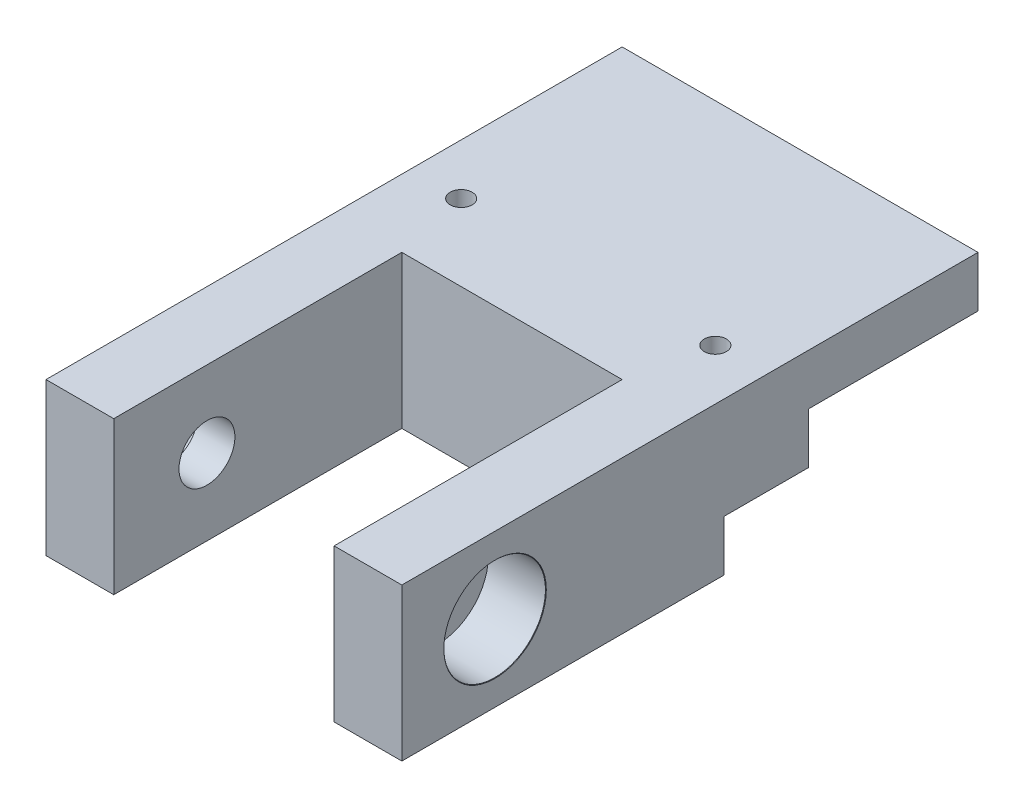
ISO-10303-21;
HEADER;
FILE_DESCRIPTION(('STEP AP214'),'2;1');
FILE_NAME('part.step','',(''),(''),'','','');
FILE_SCHEMA(('AUTOMOTIVE_DESIGN { 1 0 10303 214 1 1 1 1 }'));
ENDSEC;
DATA;
#1=APPLICATION_CONTEXT('core data for automotive mechanical design processes');
#2=APPLICATION_PROTOCOL_DEFINITION('international standard','automotive_design',2000,#1);
#3=PRODUCT_CONTEXT('',#1,'mechanical');
#4=PRODUCT('Part','Part','',(#3));
#5=PRODUCT_RELATED_PRODUCT_CATEGORY('part','',(#4));
#6=PRODUCT_DEFINITION_FORMATION('','',#4);
#7=PRODUCT_DEFINITION_CONTEXT('part definition',#1,'design');
#8=PRODUCT_DEFINITION('design','',#6,#7);
#9=PRODUCT_DEFINITION_SHAPE('','',#8);
#10=(LENGTH_UNIT() NAMED_UNIT(*) SI_UNIT(.MILLI.,.METRE.));
#11=(NAMED_UNIT(*) PLANE_ANGLE_UNIT() SI_UNIT($,.RADIAN.));
#12=(NAMED_UNIT(*) SI_UNIT($,.STERADIAN.) SOLID_ANGLE_UNIT());
#13=UNCERTAINTY_MEASURE_WITH_UNIT(LENGTH_MEASURE(1.E-05),#10,'distance_accuracy_value','');
#14=(GEOMETRIC_REPRESENTATION_CONTEXT(3) GLOBAL_UNCERTAINTY_ASSIGNED_CONTEXT((#13)) GLOBAL_UNIT_ASSIGNED_CONTEXT((#10,
#11,#12)) REPRESENTATION_CONTEXT('',''));
#15=CARTESIAN_POINT('',(0.,0.,0.));
#16=DIRECTION('',(0.,0.,1.));
#17=DIRECTION('',(1.,0.,0.));
#18=AXIS2_PLACEMENT_3D('',#15,#16,#17);
#19=CARTESIAN_POINT('',(10.5,9.,-17.));
#20=DIRECTION('',(-1.,0.,0.));
#21=DIRECTION('',(0.,0.,1.));
#22=AXIS2_PLACEMENT_3D('',#19,#20,#21);
#23=PLANE('',#22);
#24=DIRECTION('',(0.,0.,-1.));
#25=VECTOR('',#24,1.);
#26=CARTESIAN_POINT('',(10.5,0.,-17.));
#27=LINE('',#26,#25);
#28=CARTESIAN_POINT('',(10.5,0.,17.));
#29=VERTEX_POINT('',#28);
#30=CARTESIAN_POINT('',(10.5,0.,-2.00000000000001));
#31=VERTEX_POINT('',#30);
#32=EDGE_CURVE('E286',#29,#31,#27,.T.);
#33=ORIENTED_EDGE('',*,*,#32,.T.);
#34=DIRECTION('',(0.,-1.,0.));
#35=VECTOR('',#34,1.);
#36=CARTESIAN_POINT('',(10.5,3.,-2.00000000000001));
#37=LINE('',#36,#35);
#38=CARTESIAN_POINT('',(10.5,3.,-2.00000000000001));
#39=VERTEX_POINT('',#38);
#40=EDGE_CURVE('E267',#39,#31,#37,.T.);
#41=ORIENTED_EDGE('',*,*,#40,.F.);
#42=DIRECTION('',(0.,0.,1.));
#43=VECTOR('',#42,1.);
#44=CARTESIAN_POINT('',(10.5,3.,-17.));
#45=LINE('',#44,#43);
#46=CARTESIAN_POINT('',(10.5,3.,-7.));
#47=VERTEX_POINT('',#46);
#48=EDGE_CURVE('E262',#47,#39,#45,.T.);
#49=ORIENTED_EDGE('',*,*,#48,.F.);
#50=DIRECTION('',(0.,-1.,0.));
#51=VECTOR('',#50,1.);
#52=CARTESIAN_POINT('',(10.5,6.,-7.));
#53=LINE('',#52,#51);
#54=CARTESIAN_POINT('',(10.5,6.,-7.));
#55=VERTEX_POINT('',#54);
#56=EDGE_CURVE('E282',#55,#47,#53,.T.);
#57=ORIENTED_EDGE('',*,*,#56,.F.);
#58=DIRECTION('',(0.,0.,1.));
#59=VECTOR('',#58,1.);
#60=CARTESIAN_POINT('',(10.5,6.,-7.));
#61=LINE('',#60,#59);
#62=CARTESIAN_POINT('',(10.5,6.,-17.));
#63=VERTEX_POINT('',#62);
#64=EDGE_CURVE('E277',#63,#55,#61,.T.);
#65=ORIENTED_EDGE('',*,*,#64,.F.);
#66=DIRECTION('',(0.,-1.,0.));
#67=VECTOR('',#66,1.);
#68=CARTESIAN_POINT('',(10.5,9.,-17.));
#69=LINE('',#68,#67);
#70=CARTESIAN_POINT('',(10.5,9.,-17.));
#71=VERTEX_POINT('',#70);
#72=EDGE_CURVE('E46',#71,#63,#69,.T.);
#73=ORIENTED_EDGE('',*,*,#72,.F.);
#74=DIRECTION('',(0.,0.,-1.));
#75=VECTOR('',#74,1.);
#76=CARTESIAN_POINT('',(10.5,9.,-17.));
#77=LINE('',#76,#75);
#78=CARTESIAN_POINT('',(10.5,9.,17.));
#79=VERTEX_POINT('',#78);
#80=EDGE_CURVE('E289',#79,#71,#77,.T.);
#81=ORIENTED_EDGE('',*,*,#80,.F.);
#82=DIRECTION('',(0.,-1.,0.));
#83=VECTOR('',#82,1.);
#84=CARTESIAN_POINT('',(10.5,9.,17.));
#85=LINE('',#84,#83);
#86=EDGE_CURVE('E301',#79,#29,#85,.T.);
#87=ORIENTED_EDGE('',*,*,#86,.T.);
#88=EDGE_LOOP('',(#33,#41,#49,#57,#65,#73,#81,#87));
#89=FACE_BOUND('',#88,.T.);
#90=CARTESIAN_POINT('',(10.5,4.5,11.5));
#91=DIRECTION('',(1.,0.,0.));
#92=DIRECTION('',(0.,0.,-1.));
#93=AXIS2_PLACEMENT_3D('',#90,#91,#92);
#94=CIRCLE('',#93,3.025);
#95=CARTESIAN_POINT('',(10.5,4.5,8.47499999999999));
#96=VERTEX_POINT('',#95);
#97=EDGE_CURVE('E213',#96,#96,#94,.T.);
#98=ORIENTED_EDGE('',*,*,#97,.F.);
#99=EDGE_LOOP('',(#98));
#100=FACE_BOUND('',#99,.T.);
#101=ADVANCED_FACE('F39',(#89,#100),#23,.F.);
#102=CARTESIAN_POINT('',(-10.5,9.,17.));
#103=DIRECTION('',(0.,0.,-1.));
#104=DIRECTION('',(-1.,0.,0.));
#105=AXIS2_PLACEMENT_3D('',#102,#103,#104);
#106=PLANE('',#105);
#107=DIRECTION('',(1.,0.,0.));
#108=VECTOR('',#107,1.);
#109=CARTESIAN_POINT('',(-10.5,9.,17.));
#110=LINE('',#109,#108);
#111=CARTESIAN_POINT('',(6.50184802096263,9.,17.));
#112=VERTEX_POINT('',#111);
#113=EDGE_CURVE('E297',#112,#79,#110,.T.);
#114=ORIENTED_EDGE('',*,*,#113,.F.);
#115=DIRECTION('',(0.,1.,0.));
#116=VECTOR('',#115,1.);
#117=CARTESIAN_POINT('',(6.50184802096263,0.,17.));
#118=LINE('',#117,#116);
#119=CARTESIAN_POINT('',(6.50184802096263,0.,17.));
#120=VERTEX_POINT('',#119);
#121=EDGE_CURVE('E251',#120,#112,#118,.T.);
#122=ORIENTED_EDGE('',*,*,#121,.F.);
#123=DIRECTION('',(1.,0.,0.));
#124=VECTOR('',#123,1.);
#125=CARTESIAN_POINT('',(-10.5,0.,17.));
#126=LINE('',#125,#124);
#127=EDGE_CURVE('E306',#120,#29,#126,.T.);
#128=ORIENTED_EDGE('',*,*,#127,.T.);
#129=ORIENTED_EDGE('',*,*,#86,.F.);
#130=EDGE_LOOP('',(#114,#122,#128,#129));
#131=FACE_BOUND('',#130,.T.);
#132=ADVANCED_FACE('F349',(#131),#106,.F.);
#133=CARTESIAN_POINT('',(-10.5,9.,-17.));
#134=DIRECTION('',(0.,0.,1.));
#135=DIRECTION('',(1.,0.,0.));
#136=AXIS2_PLACEMENT_3D('',#133,#134,#135);
#137=PLANE('',#136);
#138=ORIENTED_EDGE('',*,*,#72,.T.);
#139=DIRECTION('',(1.,0.,0.));
#140=VECTOR('',#139,1.);
#141=CARTESIAN_POINT('',(10.5,6.,-17.));
#142=LINE('',#141,#140);
#143=CARTESIAN_POINT('',(-10.5,6.,-17.));
#144=VERTEX_POINT('',#143);
#145=EDGE_CURVE('E275',#144,#63,#142,.T.);
#146=ORIENTED_EDGE('',*,*,#145,.F.);
#147=DIRECTION('',(0.,-1.,0.));
#148=VECTOR('',#147,1.);
#149=CARTESIAN_POINT('',(-10.5,9.,-17.));
#150=LINE('',#149,#148);
#151=CARTESIAN_POINT('',(-10.5,9.,-17.));
#152=VERTEX_POINT('',#151);
#153=EDGE_CURVE('E314',#152,#144,#150,.T.);
#154=ORIENTED_EDGE('',*,*,#153,.F.);
#155=DIRECTION('',(-1.,0.,0.));
#156=VECTOR('',#155,1.);
#157=CARTESIAN_POINT('',(-10.5,9.,-17.));
#158=LINE('',#157,#156);
#159=EDGE_CURVE('E292',#71,#152,#158,.T.);
#160=ORIENTED_EDGE('',*,*,#159,.F.);
#161=EDGE_LOOP('',(#138,#146,#154,#160));
#162=FACE_BOUND('',#161,.T.);
#163=ADVANCED_FACE('F320',(#162),#137,.F.);
#164=CARTESIAN_POINT('',(-10.5,9.,-17.));
#165=DIRECTION('',(1.,0.,0.));
#166=DIRECTION('',(0.,0.,-1.));
#167=AXIS2_PLACEMENT_3D('',#164,#165,#166);
#168=PLANE('',#167);
#169=DIRECTION('',(0.,0.866025403784438,0.5));
#170=VECTOR('',#169,1.);
#171=CARTESIAN_POINT('',(-10.5,1.6,13.1743157806499));
#172=LINE('',#171,#170);
#173=CARTESIAN_POINT('',(-10.5,1.6,13.1743157806499));
#174=VERTEX_POINT('',#173);
#175=CARTESIAN_POINT('',(-10.5,4.5,14.8486315612998));
#176=VERTEX_POINT('',#175);
#177=EDGE_CURVE('E201',#174,#176,#172,.T.);
#178=ORIENTED_EDGE('',*,*,#177,.F.);
#179=DIRECTION('',(0.,0.,1.));
#180=VECTOR('',#179,1.);
#181=CARTESIAN_POINT('',(-10.5,1.6,9.82568421935008));
#182=LINE('',#181,#180);
#183=CARTESIAN_POINT('',(-10.5,1.6,9.82568421935008));
#184=VERTEX_POINT('',#183);
#185=EDGE_CURVE('E53',#184,#174,#182,.T.);
#186=ORIENTED_EDGE('',*,*,#185,.F.);
#187=DIRECTION('',(0.,-0.866025403784439,0.5));
#188=VECTOR('',#187,1.);
#189=CARTESIAN_POINT('',(-10.5,4.5,8.15136843870017));
#190=LINE('',#189,#188);
#191=CARTESIAN_POINT('',(-10.5,4.5,8.15136843870017));
#192=VERTEX_POINT('',#191);
#193=EDGE_CURVE('E184',#192,#184,#190,.T.);
#194=ORIENTED_EDGE('',*,*,#193,.F.);
#195=DIRECTION('',(0.,-0.866025403784438,-0.5));
#196=VECTOR('',#195,1.);
#197=CARTESIAN_POINT('',(-10.5,7.4,9.82568421935008));
#198=LINE('',#197,#196);
#199=CARTESIAN_POINT('',(-10.5,7.4,9.82568421935008));
#200=VERTEX_POINT('',#199);
#201=EDGE_CURVE('E187',#200,#192,#198,.T.);
#202=ORIENTED_EDGE('',*,*,#201,.F.);
#203=DIRECTION('',(0.,0.,-1.));
#204=VECTOR('',#203,1.);
#205=CARTESIAN_POINT('',(-10.5,7.4,13.1743157806499));
#206=LINE('',#205,#204);
#207=CARTESIAN_POINT('',(-10.5,7.4,13.1743157806499));
#208=VERTEX_POINT('',#207);
#209=EDGE_CURVE('E206',#208,#200,#206,.T.);
#210=ORIENTED_EDGE('',*,*,#209,.F.);
#211=DIRECTION('',(0.,0.866025403784439,-0.5));
#212=VECTOR('',#211,1.);
#213=CARTESIAN_POINT('',(-10.5,4.5,14.8486315612998));
#214=LINE('',#213,#212);
#215=EDGE_CURVE('E203',#176,#208,#214,.T.);
#216=ORIENTED_EDGE('',*,*,#215,.F.);
#217=EDGE_LOOP('',(#178,#186,#194,#202,#210,#216));
#218=FACE_BOUND('',#217,.T.);
#219=DIRECTION('',(0.,0.,-1.));
#220=VECTOR('',#219,1.);
#221=CARTESIAN_POINT('',(-10.5,3.,-17.));
#222=LINE('',#221,#220);
#223=CARTESIAN_POINT('',(-10.5,3.,-2.00000000000001));
#224=VERTEX_POINT('',#223);
#225=CARTESIAN_POINT('',(-10.5,3.,-7.));
#226=VERTEX_POINT('',#225);
#227=EDGE_CURVE('E260',#224,#226,#222,.T.);
#228=ORIENTED_EDGE('',*,*,#227,.F.);
#229=DIRECTION('',(0.,-1.,0.));
#230=VECTOR('',#229,1.);
#231=CARTESIAN_POINT('',(-10.5,3.,-2.00000000000001));
#232=LINE('',#231,#230);
#233=CARTESIAN_POINT('',(-10.5,0.,-2.00000000000001));
#234=VERTEX_POINT('',#233);
#235=EDGE_CURVE('E269',#224,#234,#232,.T.);
#236=ORIENTED_EDGE('',*,*,#235,.T.);
#237=DIRECTION('',(0.,0.,1.));
#238=VECTOR('',#237,1.);
#239=CARTESIAN_POINT('',(-10.5,0.,-17.));
#240=LINE('',#239,#238);
#241=CARTESIAN_POINT('',(-10.5,0.,17.));
#242=VERTEX_POINT('',#241);
#243=EDGE_CURVE('E304',#234,#242,#240,.T.);
#244=ORIENTED_EDGE('',*,*,#243,.T.);
#245=DIRECTION('',(0.,-1.,0.));
#246=VECTOR('',#245,1.);
#247=CARTESIAN_POINT('',(-10.5,9.,17.));
#248=LINE('',#247,#246);
#249=CARTESIAN_POINT('',(-10.5,9.,17.));
#250=VERTEX_POINT('',#249);
#251=EDGE_CURVE('E311',#250,#242,#248,.T.);
#252=ORIENTED_EDGE('',*,*,#251,.F.);
#253=DIRECTION('',(0.,0.,1.));
#254=VECTOR('',#253,1.);
#255=CARTESIAN_POINT('',(-10.5,9.,-17.));
#256=LINE('',#255,#254);
#257=EDGE_CURVE('E295',#152,#250,#256,.T.);
#258=ORIENTED_EDGE('',*,*,#257,.F.);
#259=ORIENTED_EDGE('',*,*,#153,.T.);
#260=DIRECTION('',(0.,0.,-1.));
#261=VECTOR('',#260,1.);
#262=CARTESIAN_POINT('',(-10.5,6.,-17.));
#263=LINE('',#262,#261);
#264=CARTESIAN_POINT('',(-10.5,6.,-7.));
#265=VERTEX_POINT('',#264);
#266=EDGE_CURVE('E272',#265,#144,#263,.T.);
#267=ORIENTED_EDGE('',*,*,#266,.F.);
#268=DIRECTION('',(0.,-1.,0.));
#269=VECTOR('',#268,1.);
#270=CARTESIAN_POINT('',(-10.5,6.,-7.));
#271=LINE('',#270,#269);
#272=EDGE_CURVE('E283',#265,#226,#271,.T.);
#273=ORIENTED_EDGE('',*,*,#272,.T.);
#274=EDGE_LOOP('',(#228,#236,#244,#252,#258,#259,#267,#273));
#275=FACE_BOUND('',#274,.T.);
#276=ADVANCED_FACE('F336',(#218,#275),#168,.F.);
#277=CARTESIAN_POINT('',(-6.50184802096263,0.,17.));
#278=VERTEX_POINT('',#277);
#279=EDGE_CURVE('E293',#242,#278,#126,.T.);
#280=ORIENTED_EDGE('',*,*,#279,.T.);
#281=DIRECTION('',(0.,1.,0.));
#282=VECTOR('',#281,1.);
#283=CARTESIAN_POINT('',(-6.50184802096263,0.,17.));
#284=LINE('',#283,#282);
#285=CARTESIAN_POINT('',(-6.50184802096263,9.,17.));
#286=VERTEX_POINT('',#285);
#287=EDGE_CURVE('E254',#278,#286,#284,.T.);
#288=ORIENTED_EDGE('',*,*,#287,.T.);
#289=EDGE_CURVE('E298',#250,#286,#110,.T.);
#290=ORIENTED_EDGE('',*,*,#289,.F.);
#291=ORIENTED_EDGE('',*,*,#251,.T.);
#292=EDGE_LOOP('',(#280,#288,#290,#291));
#293=FACE_BOUND('',#292,.T.);
#294=ADVANCED_FACE('F362',(#293),#106,.F.);
#295=CARTESIAN_POINT('',(0.,9.,0.));
#296=DIRECTION('',(0.,1.,0.));
#297=DIRECTION('',(0.,0.,1.));
#298=AXIS2_PLACEMENT_3D('',#295,#296,#297);
#299=PLANE('',#298);
#300=CARTESIAN_POINT('',(-7.5,9.,-4.5));
#301=DIRECTION('',(0.,1.,0.));
#302=DIRECTION('',(0.,0.,1.));
#303=AXIS2_PLACEMENT_3D('',#300,#301,#302);
#304=CIRCLE('',#303,0.650000000000013);
#305=CARTESIAN_POINT('',(-7.5,9.,-3.84999999999999));
#306=VERTEX_POINT('',#305);
#307=EDGE_CURVE('E697',#306,#306,#304,.T.);
#308=ORIENTED_EDGE('',*,*,#307,.F.);
#309=EDGE_LOOP('',(#308));
#310=FACE_BOUND('',#309,.T.);
#311=CARTESIAN_POINT('',(7.5,9.,-4.5));
#312=DIRECTION('',(0.,1.,0.));
#313=DIRECTION('',(0.,0.,1.));
#314=AXIS2_PLACEMENT_3D('',#311,#312,#313);
#315=CIRCLE('',#314,0.650000000000014);
#316=CARTESIAN_POINT('',(7.5,9.,-3.84999999999999));
#317=VERTEX_POINT('',#316);
#318=EDGE_CURVE('E699',#317,#317,#315,.T.);
#319=ORIENTED_EDGE('',*,*,#318,.F.);
#320=EDGE_LOOP('',(#319));
#321=FACE_BOUND('',#320,.T.);
#322=DIRECTION('',(0.,0.,-1.));
#323=VECTOR('',#322,1.);
#324=CARTESIAN_POINT('',(6.50184802096263,9.,0.));
#325=LINE('',#324,#323);
#326=CARTESIAN_POINT('',(6.50184802096263,9.,0.));
#327=VERTEX_POINT('',#326);
#328=EDGE_CURVE('E235',#112,#327,#325,.T.);
#329=ORIENTED_EDGE('',*,*,#328,.F.);
#330=ORIENTED_EDGE('',*,*,#113,.T.);
#331=ORIENTED_EDGE('',*,*,#80,.T.);
#332=ORIENTED_EDGE('',*,*,#159,.T.);
#333=ORIENTED_EDGE('',*,*,#257,.T.);
#334=ORIENTED_EDGE('',*,*,#289,.T.);
#335=DIRECTION('',(0.,0.,1.));
#336=VECTOR('',#335,1.);
#337=CARTESIAN_POINT('',(-6.50184802096263,9.,0.));
#338=LINE('',#337,#336);
#339=CARTESIAN_POINT('',(-6.50184802096263,9.,0.));
#340=VERTEX_POINT('',#339);
#341=EDGE_CURVE('E240',#340,#286,#338,.T.);
#342=ORIENTED_EDGE('',*,*,#341,.F.);
#343=DIRECTION('',(-1.,0.,0.));
#344=VECTOR('',#343,1.);
#345=CARTESIAN_POINT('',(6.50184802096263,9.,0.));
#346=LINE('',#345,#344);
#347=EDGE_CURVE('E247',#327,#340,#346,.T.);
#348=ORIENTED_EDGE('',*,*,#347,.F.);
#349=EDGE_LOOP('',(#329,#330,#331,#332,#333,#334,#342,#348));
#350=FACE_BOUND('',#349,.T.);
#351=ADVANCED_FACE('F342',(#310,#321,#350),#299,.T.);
#352=CARTESIAN_POINT('',(0.,0.,0.));
#353=DIRECTION('',(0.,1.,0.));
#354=DIRECTION('',(0.,0.,1.));
#355=AXIS2_PLACEMENT_3D('',#352,#353,#354);
#356=PLANE('',#355);
#357=ORIENTED_EDGE('',*,*,#127,.F.);
#358=DIRECTION('',(0.,0.,-1.));
#359=VECTOR('',#358,1.);
#360=CARTESIAN_POINT('',(6.50184802096263,0.,0.));
#361=LINE('',#360,#359);
#362=CARTESIAN_POINT('',(6.50184802096263,0.,0.));
#363=VERTEX_POINT('',#362);
#364=EDGE_CURVE('E236',#120,#363,#361,.T.);
#365=ORIENTED_EDGE('',*,*,#364,.T.);
#366=DIRECTION('',(-1.,0.,0.));
#367=VECTOR('',#366,1.);
#368=CARTESIAN_POINT('',(6.50184802096263,0.,0.));
#369=LINE('',#368,#367);
#370=CARTESIAN_POINT('',(-6.50184802096263,0.,0.));
#371=VERTEX_POINT('',#370);
#372=EDGE_CURVE('E239',#363,#371,#369,.T.);
#373=ORIENTED_EDGE('',*,*,#372,.T.);
#374=DIRECTION('',(0.,0.,1.));
#375=VECTOR('',#374,1.);
#376=CARTESIAN_POINT('',(-6.50184802096263,0.,0.));
#377=LINE('',#376,#375);
#378=EDGE_CURVE('E61',#371,#278,#377,.T.);
#379=ORIENTED_EDGE('',*,*,#378,.T.);
#380=ORIENTED_EDGE('',*,*,#279,.F.);
#381=ORIENTED_EDGE('',*,*,#243,.F.);
#382=DIRECTION('',(-1.,0.,0.));
#383=VECTOR('',#382,1.);
#384=CARTESIAN_POINT('',(-10.5,0.,-2.00000000000001));
#385=LINE('',#384,#383);
#386=EDGE_CURVE('E253',#31,#234,#385,.T.);
#387=ORIENTED_EDGE('',*,*,#386,.F.);
#388=ORIENTED_EDGE('',*,*,#32,.F.);
#389=EDGE_LOOP('',(#357,#365,#373,#379,#380,#381,#387,#388));
#390=FACE_BOUND('',#389,.T.);
#391=ADVANCED_FACE('F355',(#390),#356,.F.);
#392=CARTESIAN_POINT('',(-10.5,6.,-7.));
#393=DIRECTION('',(0.,0.,1.));
#394=DIRECTION('',(1.,0.,0.));
#395=AXIS2_PLACEMENT_3D('',#392,#393,#394);
#396=PLANE('',#395);
#397=ORIENTED_EDGE('',*,*,#56,.T.);
#398=DIRECTION('',(-1.,0.,0.));
#399=VECTOR('',#398,1.);
#400=CARTESIAN_POINT('',(-10.5,3.,-7.));
#401=LINE('',#400,#399);
#402=EDGE_CURVE('E11',#47,#226,#401,.T.);
#403=ORIENTED_EDGE('',*,*,#402,.T.);
#404=ORIENTED_EDGE('',*,*,#272,.F.);
#405=DIRECTION('',(-1.,0.,0.));
#406=VECTOR('',#405,1.);
#407=CARTESIAN_POINT('',(-10.5,6.,-7.));
#408=LINE('',#407,#406);
#409=EDGE_CURVE('E279',#55,#265,#408,.T.);
#410=ORIENTED_EDGE('',*,*,#409,.F.);
#411=EDGE_LOOP('',(#397,#403,#404,#410));
#412=FACE_BOUND('',#411,.T.);
#413=ADVANCED_FACE('F333',(#412),#396,.F.);
#414=CARTESIAN_POINT('',(0.,6.,0.));
#415=DIRECTION('',(0.,1.,0.));
#416=DIRECTION('',(0.,0.,1.));
#417=AXIS2_PLACEMENT_3D('',#414,#415,#416);
#418=PLANE('',#417);
#419=ORIENTED_EDGE('',*,*,#266,.T.);
#420=ORIENTED_EDGE('',*,*,#145,.T.);
#421=ORIENTED_EDGE('',*,*,#64,.T.);
#422=ORIENTED_EDGE('',*,*,#409,.T.);
#423=EDGE_LOOP('',(#419,#420,#421,#422));
#424=FACE_BOUND('',#423,.T.);
#425=ADVANCED_FACE('F330',(#424),#418,.F.);
#426=CARTESIAN_POINT('',(0.,3.,0.));
#427=DIRECTION('',(0.,1.,0.));
#428=DIRECTION('',(0.,0.,1.));
#429=AXIS2_PLACEMENT_3D('',#426,#427,#428);
#430=PLANE('',#429);
#431=CARTESIAN_POINT('',(-7.5,3.,-4.5));
#432=DIRECTION('',(0.,1.,0.));
#433=DIRECTION('',(0.,0.,1.));
#434=AXIS2_PLACEMENT_3D('',#431,#432,#433);
#435=CIRCLE('',#434,0.650000000000013);
#436=CARTESIAN_POINT('',(-7.5,3.,-3.84999999999999));
#437=VERTEX_POINT('',#436);
#438=EDGE_CURVE('E694',#437,#437,#435,.T.);
#439=ORIENTED_EDGE('',*,*,#438,.T.);
#440=EDGE_LOOP('',(#439));
#441=FACE_BOUND('',#440,.T.);
#442=CARTESIAN_POINT('',(7.5,3.,-4.5));
#443=DIRECTION('',(0.,1.,0.));
#444=DIRECTION('',(0.,0.,1.));
#445=AXIS2_PLACEMENT_3D('',#442,#443,#444);
#446=CIRCLE('',#445,0.650000000000013);
#447=CARTESIAN_POINT('',(7.5,3.,-3.84999999999999));
#448=VERTEX_POINT('',#447);
#449=EDGE_CURVE('E704',#448,#448,#446,.T.);
#450=ORIENTED_EDGE('',*,*,#449,.T.);
#451=EDGE_LOOP('',(#450));
#452=FACE_BOUND('',#451,.T.);
#453=ORIENTED_EDGE('',*,*,#48,.T.);
#454=DIRECTION('',(-1.,0.,0.));
#455=VECTOR('',#454,1.);
#456=CARTESIAN_POINT('',(-10.5,3.,-2.00000000000001));
#457=LINE('',#456,#455);
#458=EDGE_CURVE('E264',#39,#224,#457,.T.);
#459=ORIENTED_EDGE('',*,*,#458,.T.);
#460=ORIENTED_EDGE('',*,*,#227,.T.);
#461=ORIENTED_EDGE('',*,*,#402,.F.);
#462=EDGE_LOOP('',(#453,#459,#460,#461));
#463=FACE_BOUND('',#462,.T.);
#464=ADVANCED_FACE('F556',(#441,#452,#463),#430,.F.);
#465=CARTESIAN_POINT('',(-10.5,3.,-2.00000000000001));
#466=DIRECTION('',(0.,0.,1.));
#467=DIRECTION('',(1.,0.,0.));
#468=AXIS2_PLACEMENT_3D('',#465,#466,#467);
#469=PLANE('',#468);
#470=ORIENTED_EDGE('',*,*,#386,.T.);
#471=ORIENTED_EDGE('',*,*,#235,.F.);
#472=ORIENTED_EDGE('',*,*,#458,.F.);
#473=ORIENTED_EDGE('',*,*,#40,.T.);
#474=EDGE_LOOP('',(#470,#471,#472,#473));
#475=FACE_BOUND('',#474,.T.);
#476=ADVANCED_FACE('F359',(#475),#469,.F.);
#477=CARTESIAN_POINT('',(6.50184802096263,0.,0.));
#478=DIRECTION('',(1.,0.,0.));
#479=DIRECTION('',(0.,0.,-1.));
#480=AXIS2_PLACEMENT_3D('',#477,#478,#479);
#481=PLANE('',#480);
#482=CARTESIAN_POINT('',(6.50184802096263,4.5,11.5));
#483=DIRECTION('',(1.,0.,0.));
#484=DIRECTION('',(0.,0.,-1.));
#485=AXIS2_PLACEMENT_3D('',#482,#483,#484);
#486=CIRCLE('',#485,1.7);
#487=CARTESIAN_POINT('',(6.50184802096263,4.5,9.79999999999999));
#488=VERTEX_POINT('',#487);
#489=EDGE_CURVE('E232',#488,#488,#486,.T.);
#490=ORIENTED_EDGE('',*,*,#489,.T.);
#491=EDGE_LOOP('',(#490));
#492=FACE_BOUND('',#491,.T.);
#493=ORIENTED_EDGE('',*,*,#328,.T.);
#494=DIRECTION('',(0.,1.,0.));
#495=VECTOR('',#494,1.);
#496=CARTESIAN_POINT('',(6.50184802096263,0.,0.));
#497=LINE('',#496,#495);
#498=EDGE_CURVE('E244',#363,#327,#497,.T.);
#499=ORIENTED_EDGE('',*,*,#498,.F.);
#500=ORIENTED_EDGE('',*,*,#364,.F.);
#501=ORIENTED_EDGE('',*,*,#121,.T.);
#502=EDGE_LOOP('',(#493,#499,#500,#501));
#503=FACE_BOUND('',#502,.T.);
#504=ADVANCED_FACE('F368',(#492,#503),#481,.F.);
#505=CARTESIAN_POINT('',(-6.50184802096263,0.,0.));
#506=DIRECTION('',(-1.,0.,0.));
#507=DIRECTION('',(0.,0.,1.));
#508=AXIS2_PLACEMENT_3D('',#505,#506,#507);
#509=PLANE('',#508);
#510=CARTESIAN_POINT('',(-6.50184802096263,4.5,11.5));
#511=DIRECTION('',(-1.,0.,0.));
#512=DIRECTION('',(0.,0.,1.));
#513=AXIS2_PLACEMENT_3D('',#510,#511,#512);
#514=CIRCLE('',#513,1.65);
#515=CARTESIAN_POINT('',(-6.50184802096263,4.5,13.15));
#516=VERTEX_POINT('',#515);
#517=EDGE_CURVE('E190',#516,#516,#514,.F.);
#518=ORIENTED_EDGE('',*,*,#517,.F.);
#519=EDGE_LOOP('',(#518));
#520=FACE_BOUND('',#519,.T.);
#521=ORIENTED_EDGE('',*,*,#341,.T.);
#522=ORIENTED_EDGE('',*,*,#287,.F.);
#523=ORIENTED_EDGE('',*,*,#378,.F.);
#524=DIRECTION('',(0.,1.,0.));
#525=VECTOR('',#524,1.);
#526=CARTESIAN_POINT('',(-6.50184802096263,0.,0.));
#527=LINE('',#526,#525);
#528=EDGE_CURVE('E257',#371,#340,#527,.T.);
#529=ORIENTED_EDGE('',*,*,#528,.T.);
#530=EDGE_LOOP('',(#521,#522,#523,#529));
#531=FACE_BOUND('',#530,.T.);
#532=ADVANCED_FACE('F366',(#520,#531),#509,.F.);
#533=CARTESIAN_POINT('',(6.50184802096263,0.,0.));
#534=DIRECTION('',(0.,0.,-1.));
#535=DIRECTION('',(-1.,0.,0.));
#536=AXIS2_PLACEMENT_3D('',#533,#534,#535);
#537=PLANE('',#536);
#538=ORIENTED_EDGE('',*,*,#347,.T.);
#539=ORIENTED_EDGE('',*,*,#528,.F.);
#540=ORIENTED_EDGE('',*,*,#372,.F.);
#541=ORIENTED_EDGE('',*,*,#498,.T.);
#542=EDGE_LOOP('',(#538,#539,#540,#541));
#543=FACE_BOUND('',#542,.T.);
#544=ADVANCED_FACE('F365',(#543),#537,.F.);
#545=CARTESIAN_POINT('',(10.5,4.5,11.5));
#546=DIRECTION('',(1.,0.,0.));
#547=DIRECTION('',(0.,0.,-1.));
#548=AXIS2_PLACEMENT_3D('',#545,#546,#547);
#549=CYLINDRICAL_SURFACE('',#548,1.7);
#550=ORIENTED_EDGE('',*,*,#489,.F.);
#551=EDGE_LOOP('',(#550));
#552=FACE_BOUND('',#551,.T.);
#553=CARTESIAN_POINT('',(7.1,4.5,11.5));
#554=DIRECTION('',(1.,0.,0.));
#555=DIRECTION('',(0.,0.,-1.));
#556=AXIS2_PLACEMENT_3D('',#553,#554,#555);
#557=CIRCLE('',#556,1.7);
#558=CARTESIAN_POINT('',(7.1,4.5,9.79999999999999));
#559=VERTEX_POINT('',#558);
#560=EDGE_CURVE('E229',#559,#559,#557,.T.);
#561=ORIENTED_EDGE('',*,*,#560,.T.);
#562=EDGE_LOOP('',(#561));
#563=FACE_BOUND('',#562,.T.);
#564=ADVANCED_FACE('F375',(#552,#563),#549,.F.);
#565=CARTESIAN_POINT('',(7.1,7.5,11.5));
#566=DIRECTION('',(-1.,0.,0.));
#567=DIRECTION('',(0.,0.,1.));
#568=AXIS2_PLACEMENT_3D('',#565,#566,#567);
#569=PLANE('',#568);
#570=ORIENTED_EDGE('',*,*,#560,.F.);
#571=EDGE_LOOP('',(#570));
#572=FACE_BOUND('',#571,.T.);
#573=CARTESIAN_POINT('',(7.1,4.5,11.5));
#574=DIRECTION('',(1.,0.,0.));
#575=DIRECTION('',(0.,0.,-1.));
#576=AXIS2_PLACEMENT_3D('',#573,#574,#575);
#577=CIRCLE('',#576,3.);
#578=CARTESIAN_POINT('',(7.1,4.5,8.49999999999999));
#579=VERTEX_POINT('',#578);
#580=EDGE_CURVE('E226',#579,#579,#577,.T.);
#581=ORIENTED_EDGE('',*,*,#580,.T.);
#582=EDGE_LOOP('',(#581));
#583=FACE_BOUND('',#582,.T.);
#584=ADVANCED_FACE('F439',(#572,#583),#569,.F.);
#585=CARTESIAN_POINT('',(10.5,4.5,11.5));
#586=DIRECTION('',(1.,0.,0.));
#587=DIRECTION('',(0.,0.,-1.));
#588=AXIS2_PLACEMENT_3D('',#585,#586,#587);
#589=CYLINDRICAL_SURFACE('',#588,3.);
#590=ORIENTED_EDGE('',*,*,#580,.F.);
#591=EDGE_LOOP('',(#590));
#592=FACE_BOUND('',#591,.T.);
#593=CARTESIAN_POINT('',(10.475,4.5,11.5));
#594=DIRECTION('',(1.,0.,0.));
#595=DIRECTION('',(0.,0.,-1.));
#596=AXIS2_PLACEMENT_3D('',#593,#594,#595);
#597=CIRCLE('',#596,3.);
#598=CARTESIAN_POINT('',(10.475,4.5,8.49999999999999));
#599=VERTEX_POINT('',#598);
#600=EDGE_CURVE('E223',#599,#599,#597,.T.);
#601=ORIENTED_EDGE('',*,*,#600,.T.);
#602=EDGE_LOOP('',(#601));
#603=FACE_BOUND('',#602,.T.);
#604=ADVANCED_FACE('F435',(#592,#603),#589,.F.);
#605=CARTESIAN_POINT('',(10.5,4.5,11.5));
#606=DIRECTION('',(1.,0.,0.));
#607=DIRECTION('',(0.,0.,-1.));
#608=AXIS2_PLACEMENT_3D('',#605,#606,#607);
#609=CONICAL_SURFACE('',#608,3.025,0.785398163397448);
#610=ORIENTED_EDGE('',*,*,#600,.F.);
#611=EDGE_LOOP('',(#610));
#612=FACE_BOUND('',#611,.T.);
#613=ORIENTED_EDGE('',*,*,#97,.T.);
#614=EDGE_LOOP('',(#613));
#615=FACE_BOUND('',#614,.T.);
#616=ADVANCED_FACE('F422',(#612,#615),#609,.F.);
#617=CARTESIAN_POINT('',(-8.7,1.6,9.82568421935008));
#618=DIRECTION('',(0.,-1.,0.));
#619=DIRECTION('',(0.,0.,-1.));
#620=AXIS2_PLACEMENT_3D('',#617,#618,#619);
#621=PLANE('',#620);
#622=ORIENTED_EDGE('',*,*,#185,.T.);
#623=DIRECTION('',(-1.,0.,0.));
#624=VECTOR('',#623,1.);
#625=CARTESIAN_POINT('',(-8.7,1.6,13.1743157806499));
#626=LINE('',#625,#624);
#627=CARTESIAN_POINT('',(-8.7,1.6,13.1743157806499));
#628=VERTEX_POINT('',#627);
#629=EDGE_CURVE('E161',#628,#174,#626,.T.);
#630=ORIENTED_EDGE('',*,*,#629,.F.);
#631=DIRECTION('',(0.,0.,1.));
#632=VECTOR('',#631,1.);
#633=CARTESIAN_POINT('',(-8.7,1.6,9.82568421935008));
#634=LINE('',#633,#632);
#635=CARTESIAN_POINT('',(-8.7,1.6,9.82568421935008));
#636=VERTEX_POINT('',#635);
#637=EDGE_CURVE('E165',#636,#628,#634,.T.);
#638=ORIENTED_EDGE('',*,*,#637,.F.);
#639=DIRECTION('',(-1.,0.,0.));
#640=VECTOR('',#639,1.);
#641=CARTESIAN_POINT('',(-8.7,1.6,9.82568421935008));
#642=LINE('',#641,#640);
#643=EDGE_CURVE('E211',#636,#184,#642,.T.);
#644=ORIENTED_EDGE('',*,*,#643,.T.);
#645=EDGE_LOOP('',(#622,#630,#638,#644));
#646=FACE_BOUND('',#645,.T.);
#647=ADVANCED_FACE('F163',(#646),#621,.F.);
#648=CARTESIAN_POINT('',(-8.7,4.5,8.15136843870017));
#649=DIRECTION('',(0.,-0.5,-0.866025403784439));
#650=DIRECTION('',(0.,0.866025403784439,-0.5));
#651=AXIS2_PLACEMENT_3D('',#648,#649,#650);
#652=PLANE('',#651);
#653=ORIENTED_EDGE('',*,*,#193,.T.);
#654=ORIENTED_EDGE('',*,*,#643,.F.);
#655=DIRECTION('',(0.,-0.866025403784439,0.5));
#656=VECTOR('',#655,1.);
#657=CARTESIAN_POINT('',(-8.7,4.5,8.15136843870017));
#658=LINE('',#657,#656);
#659=CARTESIAN_POINT('',(-8.7,4.5,8.15136843870017));
#660=VERTEX_POINT('',#659);
#661=EDGE_CURVE('E171',#660,#636,#658,.T.);
#662=ORIENTED_EDGE('',*,*,#661,.F.);
#663=DIRECTION('',(-1.,0.,0.));
#664=VECTOR('',#663,1.);
#665=CARTESIAN_POINT('',(-8.7,4.5,8.15136843870017));
#666=LINE('',#665,#664);
#667=EDGE_CURVE('E214',#660,#192,#666,.T.);
#668=ORIENTED_EDGE('',*,*,#667,.T.);
#669=EDGE_LOOP('',(#653,#654,#662,#668));
#670=FACE_BOUND('',#669,.T.);
#671=ADVANCED_FACE('F414',(#670),#652,.F.);
#672=CARTESIAN_POINT('',(-8.7,7.4,9.82568421935008));
#673=DIRECTION('',(0.,0.5,-0.866025403784438));
#674=DIRECTION('',(0.,0.866025403784439,0.5));
#675=AXIS2_PLACEMENT_3D('',#672,#673,#674);
#676=PLANE('',#675);
#677=ORIENTED_EDGE('',*,*,#201,.T.);
#678=ORIENTED_EDGE('',*,*,#667,.F.);
#679=DIRECTION('',(0.,-0.866025403784438,-0.5));
#680=VECTOR('',#679,1.);
#681=CARTESIAN_POINT('',(-8.7,7.4,9.82568421935008));
#682=LINE('',#681,#680);
#683=CARTESIAN_POINT('',(-8.7,7.4,9.82568421935008));
#684=VERTEX_POINT('',#683);
#685=EDGE_CURVE('E197',#684,#660,#682,.T.);
#686=ORIENTED_EDGE('',*,*,#685,.F.);
#687=DIRECTION('',(-1.,0.,0.));
#688=VECTOR('',#687,1.);
#689=CARTESIAN_POINT('',(-8.7,7.4,9.82568421935008));
#690=LINE('',#689,#688);
#691=EDGE_CURVE('E216',#684,#200,#690,.T.);
#692=ORIENTED_EDGE('',*,*,#691,.T.);
#693=EDGE_LOOP('',(#677,#678,#686,#692));
#694=FACE_BOUND('',#693,.T.);
#695=ADVANCED_FACE('F412',(#694),#676,.F.);
#696=CARTESIAN_POINT('',(-8.7,7.4,13.1743157806499));
#697=DIRECTION('',(0.,1.,0.));
#698=DIRECTION('',(0.,0.,1.));
#699=AXIS2_PLACEMENT_3D('',#696,#697,#698);
#700=PLANE('',#699);
#701=ORIENTED_EDGE('',*,*,#209,.T.);
#702=ORIENTED_EDGE('',*,*,#691,.F.);
#703=DIRECTION('',(0.,0.,-1.));
#704=VECTOR('',#703,1.);
#705=CARTESIAN_POINT('',(-8.7,7.4,13.1743157806499));
#706=LINE('',#705,#704);
#707=CARTESIAN_POINT('',(-8.7,7.4,13.1743157806499));
#708=VERTEX_POINT('',#707);
#709=EDGE_CURVE('E194',#708,#684,#706,.T.);
#710=ORIENTED_EDGE('',*,*,#709,.F.);
#711=DIRECTION('',(-1.,0.,0.));
#712=VECTOR('',#711,1.);
#713=CARTESIAN_POINT('',(-8.7,7.4,13.1743157806499));
#714=LINE('',#713,#712);
#715=EDGE_CURVE('E218',#708,#208,#714,.T.);
#716=ORIENTED_EDGE('',*,*,#715,.T.);
#717=EDGE_LOOP('',(#701,#702,#710,#716));
#718=FACE_BOUND('',#717,.T.);
#719=ADVANCED_FACE('F410',(#718),#700,.F.);
#720=CARTESIAN_POINT('',(-8.7,4.5,14.8486315612998));
#721=DIRECTION('',(0.,0.5,0.866025403784439));
#722=DIRECTION('',(0.,-0.866025403784439,0.5));
#723=AXIS2_PLACEMENT_3D('',#720,#721,#722);
#724=PLANE('',#723);
#725=ORIENTED_EDGE('',*,*,#215,.T.);
#726=ORIENTED_EDGE('',*,*,#715,.F.);
#727=DIRECTION('',(0.,0.866025403784439,-0.5));
#728=VECTOR('',#727,1.);
#729=CARTESIAN_POINT('',(-8.7,4.5,14.8486315612998));
#730=LINE('',#729,#728);
#731=CARTESIAN_POINT('',(-8.7,4.5,14.8486315612998));
#732=VERTEX_POINT('',#731);
#733=EDGE_CURVE('E179',#732,#708,#730,.T.);
#734=ORIENTED_EDGE('',*,*,#733,.F.);
#735=DIRECTION('',(-1.,0.,0.));
#736=VECTOR('',#735,1.);
#737=CARTESIAN_POINT('',(-8.7,4.5,14.8486315612998));
#738=LINE('',#737,#736);
#739=EDGE_CURVE('E170',#732,#176,#738,.T.);
#740=ORIENTED_EDGE('',*,*,#739,.T.);
#741=EDGE_LOOP('',(#725,#726,#734,#740));
#742=FACE_BOUND('',#741,.T.);
#743=ADVANCED_FACE('F406',(#742),#724,.F.);
#744=CARTESIAN_POINT('',(-8.7,1.6,13.1743157806499));
#745=DIRECTION('',(0.,-0.5,0.866025403784438));
#746=DIRECTION('',(0.,-0.866025403784439,-0.5));
#747=AXIS2_PLACEMENT_3D('',#744,#745,#746);
#748=PLANE('',#747);
#749=ORIENTED_EDGE('',*,*,#177,.T.);
#750=ORIENTED_EDGE('',*,*,#739,.F.);
#751=DIRECTION('',(0.,0.866025403784438,0.5));
#752=VECTOR('',#751,1.);
#753=CARTESIAN_POINT('',(-8.7,1.6,13.1743157806499));
#754=LINE('',#753,#752);
#755=EDGE_CURVE('E174',#628,#732,#754,.T.);
#756=ORIENTED_EDGE('',*,*,#755,.F.);
#757=ORIENTED_EDGE('',*,*,#629,.T.);
#758=EDGE_LOOP('',(#749,#750,#756,#757));
#759=FACE_BOUND('',#758,.T.);
#760=ADVANCED_FACE('F175',(#759),#748,.F.);
#761=CARTESIAN_POINT('',(-8.7,0.,0.));
#762=DIRECTION('',(-1.,0.,0.));
#763=DIRECTION('',(0.,0.,1.));
#764=AXIS2_PLACEMENT_3D('',#761,#762,#763);
#765=PLANE('',#764);
#766=CARTESIAN_POINT('',(-8.7,4.5,11.5));
#767=DIRECTION('',(-1.,0.,0.));
#768=DIRECTION('',(0.,0.,1.));
#769=AXIS2_PLACEMENT_3D('',#766,#767,#768);
#770=CIRCLE('',#769,1.65);
#771=CARTESIAN_POINT('',(-8.7,4.5,13.15));
#772=VERTEX_POINT('',#771);
#773=EDGE_CURVE('E706',#772,#772,#770,.T.);
#774=ORIENTED_EDGE('',*,*,#773,.F.);
#775=EDGE_LOOP('',(#774));
#776=FACE_BOUND('',#775,.T.);
#777=ORIENTED_EDGE('',*,*,#637,.T.);
#778=ORIENTED_EDGE('',*,*,#755,.T.);
#779=ORIENTED_EDGE('',*,*,#733,.T.);
#780=ORIENTED_EDGE('',*,*,#709,.T.);
#781=ORIENTED_EDGE('',*,*,#685,.T.);
#782=ORIENTED_EDGE('',*,*,#661,.T.);
#783=EDGE_LOOP('',(#777,#778,#779,#780,#781,#782));
#784=FACE_BOUND('',#783,.T.);
#785=ADVANCED_FACE('F181',(#776,#784),#765,.T.);
#786=CARTESIAN_POINT('',(10.501,4.5,11.5));
#787=DIRECTION('',(-1.,0.,0.));
#788=DIRECTION('',(0.,0.,1.));
#789=AXIS2_PLACEMENT_3D('',#786,#787,#788);
#790=CYLINDRICAL_SURFACE('',#789,1.65);
#791=ORIENTED_EDGE('',*,*,#773,.T.);
#792=EDGE_LOOP('',(#791));
#793=FACE_BOUND('',#792,.T.);
#794=ORIENTED_EDGE('',*,*,#517,.T.);
#795=EDGE_LOOP('',(#794));
#796=FACE_BOUND('',#795,.T.);
#797=ADVANCED_FACE('F528',(#793,#796),#790,.F.);
#798=CARTESIAN_POINT('',(7.5,9.,-4.5));
#799=DIRECTION('',(0.,1.,0.));
#800=DIRECTION('',(0.,0.,1.));
#801=AXIS2_PLACEMENT_3D('',#798,#799,#800);
#802=CYLINDRICAL_SURFACE('',#801,0.650000000000013);
#803=ORIENTED_EDGE('',*,*,#449,.F.);
#804=EDGE_LOOP('',(#803));
#805=FACE_BOUND('',#804,.T.);
#806=ORIENTED_EDGE('',*,*,#318,.T.);
#807=EDGE_LOOP('',(#806));
#808=FACE_BOUND('',#807,.T.);
#809=ADVANCED_FACE('F538',(#805,#808),#802,.F.);
#810=CARTESIAN_POINT('',(-7.5,9.,-4.5));
#811=DIRECTION('',(0.,1.,0.));
#812=DIRECTION('',(0.,0.,1.));
#813=AXIS2_PLACEMENT_3D('',#810,#811,#812);
#814=CYLINDRICAL_SURFACE('',#813,0.650000000000013);
#815=ORIENTED_EDGE('',*,*,#438,.F.);
#816=EDGE_LOOP('',(#815));
#817=FACE_BOUND('',#816,.T.);
#818=ORIENTED_EDGE('',*,*,#307,.T.);
#819=EDGE_LOOP('',(#818));
#820=FACE_BOUND('',#819,.T.);
#821=ADVANCED_FACE('F573',(#817,#820),#814,.F.);
#822=CLOSED_SHELL('',(#101,#132,#163,#276,#294,#351,#391,#413,#425,#464,#476,#504,#532,#544,
#564,#584,#604,#616,#647,#671,#695,#719,#743,#760,#785,#797,#809,#821));
#823=MANIFOLD_SOLID_BREP('B2',#822);
#824=ADVANCED_BREP_SHAPE_REPRESENTATION('',(#18,#823),#14);
#825=SHAPE_DEFINITION_REPRESENTATION(#9,#824);
ENDSEC;
END-ISO-10303-21;
